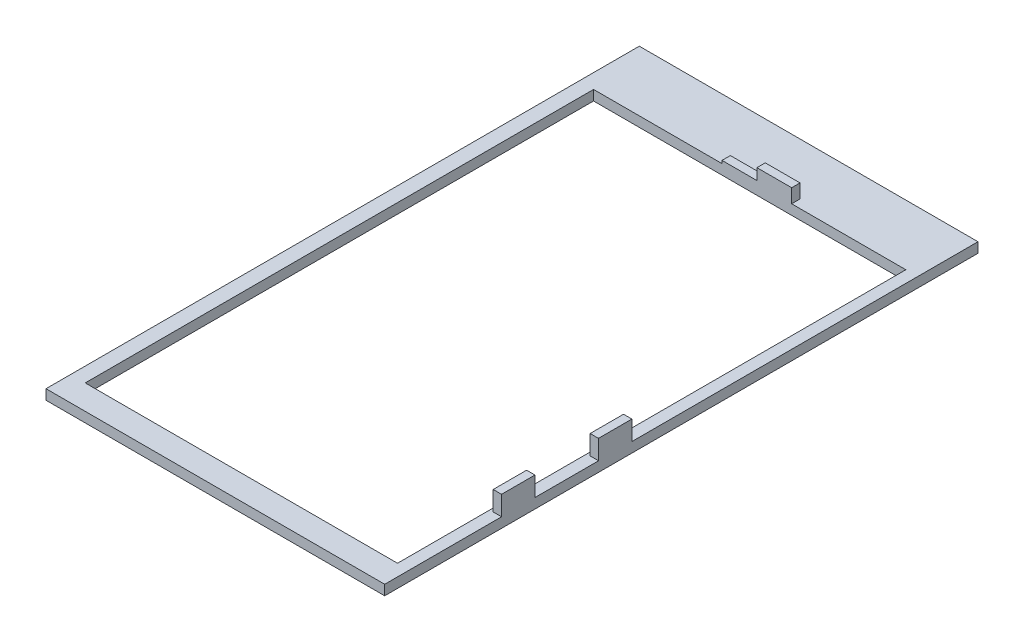
ISO-10303-21;
HEADER;
FILE_DESCRIPTION(('STEP AP214'),'2;1');
FILE_NAME('part.step','',(''),(''),'','','');
FILE_SCHEMA(('AUTOMOTIVE_DESIGN { 1 0 10303 214 1 1 1 1 }'));
ENDSEC;
DATA;
#1=APPLICATION_CONTEXT('core data for automotive mechanical design processes');
#2=APPLICATION_PROTOCOL_DEFINITION('international standard','automotive_design',2000,#1);
#3=PRODUCT_CONTEXT('',#1,'mechanical');
#4=PRODUCT('Part','Part','',(#3));
#5=PRODUCT_RELATED_PRODUCT_CATEGORY('part','',(#4));
#6=PRODUCT_DEFINITION_FORMATION('','',#4);
#7=PRODUCT_DEFINITION_CONTEXT('part definition',#1,'design');
#8=PRODUCT_DEFINITION('design','',#6,#7);
#9=PRODUCT_DEFINITION_SHAPE('','',#8);
#10=(LENGTH_UNIT() NAMED_UNIT(*) SI_UNIT(.MILLI.,.METRE.));
#11=(NAMED_UNIT(*) PLANE_ANGLE_UNIT() SI_UNIT($,.RADIAN.));
#12=(NAMED_UNIT(*) SI_UNIT($,.STERADIAN.) SOLID_ANGLE_UNIT());
#13=UNCERTAINTY_MEASURE_WITH_UNIT(LENGTH_MEASURE(1.E-05),#10,'distance_accuracy_value','');
#14=(GEOMETRIC_REPRESENTATION_CONTEXT(3) GLOBAL_UNCERTAINTY_ASSIGNED_CONTEXT((#13)) GLOBAL_UNIT_ASSIGNED_CONTEXT((#10,
#11,#12)) REPRESENTATION_CONTEXT('',''));
#15=CARTESIAN_POINT('',(0.,0.,0.));
#16=DIRECTION('',(0.,0.,1.));
#17=DIRECTION('',(1.,0.,0.));
#18=AXIS2_PLACEMENT_3D('',#15,#16,#17);
#19=CARTESIAN_POINT('',(0.,1.8,-16.8660709602015));
#20=DIRECTION('',(0.,0.,-1.));
#21=DIRECTION('',(-1.,0.,0.));
#22=AXIS2_PLACEMENT_3D('',#19,#20,#21);
#23=PLANE('',#22);
#24=DIRECTION('',(1.,0.,0.));
#25=VECTOR('',#24,1.);
#26=CARTESIAN_POINT('',(0.,0.,-16.8660709602015));
#27=LINE('',#26,#25);
#28=CARTESIAN_POINT('',(-30.193578772237,0.,-16.8660709602015));
#29=VERTEX_POINT('',#28);
#30=CARTESIAN_POINT('',(30.606421227763,0.,-16.8660709602015));
#31=VERTEX_POINT('',#30);
#32=EDGE_CURVE('E333',#29,#31,#27,.T.);
#33=ORIENTED_EDGE('',*,*,#32,.F.);
#34=DIRECTION('',(0.,-1.,0.));
#35=VECTOR('',#34,1.);
#36=CARTESIAN_POINT('',(-30.193578772237,1.8,-16.8660709602015));
#37=LINE('',#36,#35);
#38=CARTESIAN_POINT('',(-30.193578772237,1.8,-16.8660709602015));
#39=VERTEX_POINT('',#38);
#40=EDGE_CURVE('E11',#39,#29,#37,.T.);
#41=ORIENTED_EDGE('',*,*,#40,.F.);
#42=DIRECTION('',(1.,0.,0.));
#43=VECTOR('',#42,1.);
#44=CARTESIAN_POINT('',(0.,1.8,-16.8660709602015));
#45=LINE('',#44,#43);
#46=CARTESIAN_POINT('',(30.606421227763,1.8,-16.8660709602015));
#47=VERTEX_POINT('',#46);
#48=EDGE_CURVE('E309',#39,#47,#45,.T.);
#49=ORIENTED_EDGE('',*,*,#48,.T.);
#50=DIRECTION('',(0.,-1.,0.));
#51=VECTOR('',#50,1.);
#52=CARTESIAN_POINT('',(30.606421227763,1.8,-16.8660709602015));
#53=LINE('',#52,#51);
#54=EDGE_CURVE('E344',#47,#31,#53,.T.);
#55=ORIENTED_EDGE('',*,*,#54,.T.);
#56=EDGE_LOOP('',(#33,#41,#49,#55));
#57=FACE_BOUND('',#56,.T.);
#58=ADVANCED_FACE('F35',(#57),#23,.T.);
#59=CARTESIAN_POINT('',(-30.193578772237,1.8,0.));
#60=DIRECTION('',(-1.,0.,0.));
#61=DIRECTION('',(0.,0.,1.));
#62=AXIS2_PLACEMENT_3D('',#59,#60,#61);
#63=PLANE('',#62);
#64=DIRECTION('',(0.,0.,-1.));
#65=VECTOR('',#64,1.);
#66=CARTESIAN_POINT('',(-30.193578772237,0.,0.));
#67=LINE('',#66,#65);
#68=CARTESIAN_POINT('',(-30.193578772237,0.,89.6339290397985));
#69=VERTEX_POINT('',#68);
#70=EDGE_CURVE('E336',#69,#29,#67,.T.);
#71=ORIENTED_EDGE('',*,*,#70,.F.);
#72=DIRECTION('',(0.,-1.,0.));
#73=VECTOR('',#72,1.);
#74=CARTESIAN_POINT('',(-30.193578772237,1.8,89.6339290397985));
#75=LINE('',#74,#73);
#76=CARTESIAN_POINT('',(-30.193578772237,1.8,89.6339290397985));
#77=VERTEX_POINT('',#76);
#78=EDGE_CURVE('E44',#77,#69,#75,.T.);
#79=ORIENTED_EDGE('',*,*,#78,.F.);
#80=DIRECTION('',(0.,0.,-1.));
#81=VECTOR('',#80,1.);
#82=CARTESIAN_POINT('',(-30.193578772237,1.8,0.));
#83=LINE('',#82,#81);
#84=EDGE_CURVE('E312',#77,#39,#83,.T.);
#85=ORIENTED_EDGE('',*,*,#84,.T.);
#86=ORIENTED_EDGE('',*,*,#40,.T.);
#87=EDGE_LOOP('',(#71,#79,#85,#86));
#88=FACE_BOUND('',#87,.T.);
#89=ADVANCED_FACE('F383',(#88),#63,.T.);
#90=CARTESIAN_POINT('',(0.,1.8,89.6339290397985));
#91=DIRECTION('',(0.,0.,1.));
#92=DIRECTION('',(1.,0.,0.));
#93=AXIS2_PLACEMENT_3D('',#90,#91,#92);
#94=PLANE('',#93);
#95=DIRECTION('',(-1.,0.,0.));
#96=VECTOR('',#95,1.);
#97=CARTESIAN_POINT('',(0.,0.,89.6339290397985));
#98=LINE('',#97,#96);
#99=CARTESIAN_POINT('',(30.606421227763,0.,89.6339290397985));
#100=VERTEX_POINT('',#99);
#101=EDGE_CURVE('E339',#100,#69,#98,.T.);
#102=ORIENTED_EDGE('',*,*,#101,.F.);
#103=DIRECTION('',(0.,-1.,0.));
#104=VECTOR('',#103,1.);
#105=CARTESIAN_POINT('',(30.606421227763,1.8,89.6339290397985));
#106=LINE('',#105,#104);
#107=CARTESIAN_POINT('',(30.606421227763,1.8,89.6339290397985));
#108=VERTEX_POINT('',#107);
#109=EDGE_CURVE('E346',#108,#100,#106,.T.);
#110=ORIENTED_EDGE('',*,*,#109,.F.);
#111=DIRECTION('',(-1.,0.,0.));
#112=VECTOR('',#111,1.);
#113=CARTESIAN_POINT('',(0.,1.8,89.6339290397985));
#114=LINE('',#113,#112);
#115=EDGE_CURVE('E315',#108,#77,#114,.T.);
#116=ORIENTED_EDGE('',*,*,#115,.T.);
#117=ORIENTED_EDGE('',*,*,#78,.T.);
#118=EDGE_LOOP('',(#102,#110,#116,#117));
#119=FACE_BOUND('',#118,.T.);
#120=ADVANCED_FACE('F389',(#119),#94,.T.);
#121=CARTESIAN_POINT('',(-27.573578772237,1.8,0.));
#122=DIRECTION('',(1.,0.,0.));
#123=DIRECTION('',(0.,0.,-1.));
#124=AXIS2_PLACEMENT_3D('',#121,#122,#123);
#125=PLANE('',#124);
#126=DIRECTION('',(0.,0.,1.));
#127=VECTOR('',#126,1.);
#128=CARTESIAN_POINT('',(-27.573578772237,0.,0.));
#129=LINE('',#128,#127);
#130=CARTESIAN_POINT('',(-27.573578772237,0.,-6.03607096020148));
#131=VERTEX_POINT('',#130);
#132=CARTESIAN_POINT('',(-27.573578772237,0.,85.2139290397985));
#133=VERTEX_POINT('',#132);
#134=EDGE_CURVE('E285',#131,#133,#129,.T.);
#135=ORIENTED_EDGE('',*,*,#134,.F.);
#136=DIRECTION('',(0.,-1.,0.));
#137=VECTOR('',#136,1.);
#138=CARTESIAN_POINT('',(-27.573578772237,1.8,-6.03607096020148));
#139=LINE('',#138,#137);
#140=CARTESIAN_POINT('',(-27.573578772237,1.8,-6.03607096020148));
#141=VERTEX_POINT('',#140);
#142=EDGE_CURVE('E39',#141,#131,#139,.T.);
#143=ORIENTED_EDGE('',*,*,#142,.F.);
#144=DIRECTION('',(0.,0.,1.));
#145=VECTOR('',#144,1.);
#146=CARTESIAN_POINT('',(-27.573578772237,1.8,0.));
#147=LINE('',#146,#145);
#148=CARTESIAN_POINT('',(-27.573578772237,1.8,85.2139290397985));
#149=VERTEX_POINT('',#148);
#150=EDGE_CURVE('E296',#141,#149,#147,.T.);
#151=ORIENTED_EDGE('',*,*,#150,.T.);
#152=DIRECTION('',(0.,-1.,0.));
#153=VECTOR('',#152,1.);
#154=CARTESIAN_POINT('',(-27.573578772237,1.8,85.2139290397985));
#155=LINE('',#154,#153);
#156=EDGE_CURVE('E321',#149,#133,#155,.T.);
#157=ORIENTED_EDGE('',*,*,#156,.T.);
#158=EDGE_LOOP('',(#135,#143,#151,#157));
#159=FACE_BOUND('',#158,.T.);
#160=ADVANCED_FACE('F37',(#159),#125,.T.);
#161=CARTESIAN_POINT('',(0.,1.8,-6.03607096020148));
#162=DIRECTION('',(0.,0.,-1.));
#163=DIRECTION('',(-1.,0.,0.));
#164=AXIS2_PLACEMENT_3D('',#161,#162,#163);
#165=PLANE('',#164);
#166=DIRECTION('',(1.,0.,0.));
#167=VECTOR('',#166,1.);
#168=CARTESIAN_POINT('',(0.,0.,-6.03607096020148));
#169=LINE('',#168,#167);
#170=CARTESIAN_POINT('',(28.486421227763,0.,-6.03607096020148));
#171=VERTEX_POINT('',#170);
#172=EDGE_CURVE('E325',#131,#171,#169,.T.);
#173=ORIENTED_EDGE('',*,*,#172,.T.);
#174=DIRECTION('',(0.,-1.,0.));
#175=VECTOR('',#174,1.);
#176=CARTESIAN_POINT('',(28.486421227763,1.8,-6.03607096020148));
#177=LINE('',#176,#175);
#178=CARTESIAN_POINT('',(28.486421227763,1.8,-6.03607096020148));
#179=VERTEX_POINT('',#178);
#180=EDGE_CURVE('E351',#179,#171,#177,.T.);
#181=ORIENTED_EDGE('',*,*,#180,.F.);
#182=DIRECTION('',(1.,0.,0.));
#183=VECTOR('',#182,1.);
#184=CARTESIAN_POINT('',(0.,1.8,-6.03607096020148));
#185=LINE('',#184,#183);
#186=CARTESIAN_POINT('',(7.98642122776299,1.8,-6.03607096020148));
#187=VERTEX_POINT('',#186);
#188=EDGE_CURVE('E299',#187,#179,#185,.T.);
#189=ORIENTED_EDGE('',*,*,#188,.F.);
#190=DIRECTION('',(0.,1.,0.));
#191=VECTOR('',#190,1.);
#192=CARTESIAN_POINT('',(7.98642122776299,1.8,-6.03607096020148));
#193=LINE('',#192,#191);
#194=CARTESIAN_POINT('',(7.98642122776299,4.3,-6.03607096020148));
#195=VERTEX_POINT('',#194);
#196=EDGE_CURVE('E243',#187,#195,#193,.T.);
#197=ORIENTED_EDGE('',*,*,#196,.T.);
#198=DIRECTION('',(-1.,0.,0.));
#199=VECTOR('',#198,1.);
#200=CARTESIAN_POINT('',(1.74968633608684,4.3,-6.03607096020148));
#201=LINE('',#200,#199);
#202=CARTESIAN_POINT('',(1.74968633608684,4.3,-6.03607096020148));
#203=VERTEX_POINT('',#202);
#204=EDGE_CURVE('E272',#195,#203,#201,.T.);
#205=ORIENTED_EDGE('',*,*,#204,.T.);
#206=DIRECTION('',(0.,-1.,0.));
#207=VECTOR('',#206,1.);
#208=CARTESIAN_POINT('',(1.74968633608684,4.3,-6.03607096020148));
#209=LINE('',#208,#207);
#210=CARTESIAN_POINT('',(1.74968633608684,2.3,-6.03607096020148));
#211=VERTEX_POINT('',#210);
#212=EDGE_CURVE('E275',#203,#211,#209,.T.);
#213=ORIENTED_EDGE('',*,*,#212,.T.);
#214=DIRECTION('',(-1.,0.,0.));
#215=VECTOR('',#214,1.);
#216=CARTESIAN_POINT('',(-4.51357877223701,2.3,-6.03607096020148));
#217=LINE('',#216,#215);
#218=CARTESIAN_POINT('',(-4.51357877223701,2.3,-6.03607096020148));
#219=VERTEX_POINT('',#218);
#220=EDGE_CURVE('E278',#211,#219,#217,.T.);
#221=ORIENTED_EDGE('',*,*,#220,.T.);
#222=DIRECTION('',(0.0245646663522028,-0.999698243054876,0.));
#223=VECTOR('',#222,1.);
#224=CARTESIAN_POINT('',(-4.50129273166284,1.8,-6.03607096020148));
#225=LINE('',#224,#223);
#226=CARTESIAN_POINT('',(-4.50129273166284,1.8,-6.03607096020148));
#227=VERTEX_POINT('',#226);
#228=EDGE_CURVE('E254',#219,#227,#225,.T.);
#229=ORIENTED_EDGE('',*,*,#228,.T.);
#230=EDGE_CURVE('E301',#141,#227,#185,.T.);
#231=ORIENTED_EDGE('',*,*,#230,.F.);
#232=ORIENTED_EDGE('',*,*,#142,.T.);
#233=EDGE_LOOP('',(#173,#181,#189,#197,#205,#213,#221,#229,#231,#232));
#234=FACE_BOUND('',#233,.T.);
#235=ADVANCED_FACE('F360',(#234),#165,.F.);
#236=CARTESIAN_POINT('',(28.486421227763,1.8,0.));
#237=DIRECTION('',(1.,0.,0.));
#238=DIRECTION('',(0.,0.,-1.));
#239=AXIS2_PLACEMENT_3D('',#236,#237,#238);
#240=PLANE('',#239);
#241=DIRECTION('',(0.,0.,1.));
#242=VECTOR('',#241,1.);
#243=CARTESIAN_POINT('',(28.486421227763,0.,0.));
#244=LINE('',#243,#242);
#245=CARTESIAN_POINT('',(28.486421227763,0.,85.2139290397985));
#246=VERTEX_POINT('',#245);
#247=EDGE_CURVE('E327',#171,#246,#244,.T.);
#248=ORIENTED_EDGE('',*,*,#247,.T.);
#249=DIRECTION('',(0.,-1.,0.));
#250=VECTOR('',#249,1.);
#251=CARTESIAN_POINT('',(28.486421227763,1.8,85.2139290397985));
#252=LINE('',#251,#250);
#253=CARTESIAN_POINT('',(28.486421227763,1.8,85.2139290397985));
#254=VERTEX_POINT('',#253);
#255=EDGE_CURVE('E350',#254,#246,#252,.T.);
#256=ORIENTED_EDGE('',*,*,#255,.F.);
#257=DIRECTION('',(0.,0.,1.));
#258=VECTOR('',#257,1.);
#259=CARTESIAN_POINT('',(28.486421227763,1.8,0.));
#260=LINE('',#259,#258);
#261=EDGE_CURVE('E304',#179,#254,#260,.T.);
#262=ORIENTED_EDGE('',*,*,#261,.F.);
#263=ORIENTED_EDGE('',*,*,#180,.T.);
#264=EDGE_LOOP('',(#248,#256,#262,#263));
#265=FACE_BOUND('',#264,.T.);
#266=ADVANCED_FACE('F372',(#265),#240,.F.);
#267=CARTESIAN_POINT('',(0.,1.8,85.2139290397985));
#268=DIRECTION('',(0.,0.,-1.));
#269=DIRECTION('',(-1.,0.,0.));
#270=AXIS2_PLACEMENT_3D('',#267,#268,#269);
#271=PLANE('',#270);
#272=DIRECTION('',(1.,0.,0.));
#273=VECTOR('',#272,1.);
#274=CARTESIAN_POINT('',(0.,0.,85.2139290397985));
#275=LINE('',#274,#273);
#276=EDGE_CURVE('E330',#133,#246,#275,.T.);
#277=ORIENTED_EDGE('',*,*,#276,.F.);
#278=ORIENTED_EDGE('',*,*,#156,.F.);
#279=DIRECTION('',(1.,0.,0.));
#280=VECTOR('',#279,1.);
#281=CARTESIAN_POINT('',(0.,1.8,85.2139290397985));
#282=LINE('',#281,#280);
#283=EDGE_CURVE('E306',#149,#254,#282,.T.);
#284=ORIENTED_EDGE('',*,*,#283,.T.);
#285=ORIENTED_EDGE('',*,*,#255,.T.);
#286=EDGE_LOOP('',(#277,#278,#284,#285));
#287=FACE_BOUND('',#286,.T.);
#288=ADVANCED_FACE('F370',(#287),#271,.T.);
#289=CARTESIAN_POINT('',(30.606421227763,1.8,0.));
#290=DIRECTION('',(-1.,0.,0.));
#291=DIRECTION('',(0.,0.,1.));
#292=AXIS2_PLACEMENT_3D('',#289,#290,#291);
#293=PLANE('',#292);
#294=DIRECTION('',(0.,0.,-1.));
#295=VECTOR('',#294,1.);
#296=CARTESIAN_POINT('',(30.606421227763,0.,0.));
#297=LINE('',#296,#295);
#298=EDGE_CURVE('E300',#100,#31,#297,.T.);
#299=ORIENTED_EDGE('',*,*,#298,.T.);
#300=ORIENTED_EDGE('',*,*,#54,.F.);
#301=DIRECTION('',(0.,0.,-1.));
#302=VECTOR('',#301,1.);
#303=CARTESIAN_POINT('',(30.606421227763,1.8,0.));
#304=LINE('',#303,#302);
#305=CARTESIAN_POINT('',(30.606421227763,1.8,45.2639290397985));
#306=VERTEX_POINT('',#305);
#307=EDGE_CURVE('E318',#306,#47,#304,.T.);
#308=ORIENTED_EDGE('',*,*,#307,.F.);
#309=DIRECTION('',(0.,1.,0.));
#310=VECTOR('',#309,1.);
#311=CARTESIAN_POINT('',(30.606421227763,5.3,45.2639290397985));
#312=LINE('',#311,#310);
#313=CARTESIAN_POINT('',(30.606421227763,5.3,45.2639290397985));
#314=VERTEX_POINT('',#313);
#315=EDGE_CURVE('E211',#306,#314,#312,.T.);
#316=ORIENTED_EDGE('',*,*,#315,.T.);
#317=DIRECTION('',(0.,0.,1.));
#318=VECTOR('',#317,1.);
#319=CARTESIAN_POINT('',(30.606421227763,5.3,51.2639290397985));
#320=LINE('',#319,#318);
#321=CARTESIAN_POINT('',(30.606421227763,5.3,51.2639290397985));
#322=VERTEX_POINT('',#321);
#323=EDGE_CURVE('E190',#314,#322,#320,.T.);
#324=ORIENTED_EDGE('',*,*,#323,.T.);
#325=DIRECTION('',(0.,-0.999983332759982,-0.00577357794089441));
#326=VECTOR('',#325,1.);
#327=CARTESIAN_POINT('',(30.606421227763,1.8,51.2437211801961));
#328=LINE('',#327,#326);
#329=CARTESIAN_POINT('',(30.606421227763,1.8,51.2437211801961));
#330=VERTEX_POINT('',#329);
#331=EDGE_CURVE('E207',#322,#330,#328,.T.);
#332=ORIENTED_EDGE('',*,*,#331,.T.);
#333=CARTESIAN_POINT('',(30.606421227763,1.8,62.6639290397985));
#334=VERTEX_POINT('',#333);
#335=EDGE_CURVE('E322',#334,#330,#304,.T.);
#336=ORIENTED_EDGE('',*,*,#335,.F.);
#337=DIRECTION('',(0.,1.,0.));
#338=VECTOR('',#337,1.);
#339=CARTESIAN_POINT('',(30.606421227763,5.3,62.6639290397985));
#340=LINE('',#339,#338);
#341=CARTESIAN_POINT('',(30.606421227763,5.3,62.6639290397985));
#342=VERTEX_POINT('',#341);
#343=EDGE_CURVE('E217',#334,#342,#340,.T.);
#344=ORIENTED_EDGE('',*,*,#343,.T.);
#345=DIRECTION('',(0.,0.,1.));
#346=VECTOR('',#345,1.);
#347=CARTESIAN_POINT('',(30.606421227763,5.3,68.6639290397985));
#348=LINE('',#347,#346);
#349=CARTESIAN_POINT('',(30.606421227763,5.3,68.6639290397985));
#350=VERTEX_POINT('',#349);
#351=EDGE_CURVE('E235',#342,#350,#348,.T.);
#352=ORIENTED_EDGE('',*,*,#351,.T.);
#353=DIRECTION('',(0.,-0.999998271125345,-0.00185950163268687));
#354=VECTOR('',#353,1.);
#355=CARTESIAN_POINT('',(30.606421227763,1.8,68.6574207728321));
#356=LINE('',#355,#354);
#357=CARTESIAN_POINT('',(30.606421227763,1.8,68.6574207728321));
#358=VERTEX_POINT('',#357);
#359=EDGE_CURVE('E223',#350,#358,#356,.T.);
#360=ORIENTED_EDGE('',*,*,#359,.T.);
#361=EDGE_CURVE('E319',#108,#358,#304,.T.);
#362=ORIENTED_EDGE('',*,*,#361,.F.);
#363=ORIENTED_EDGE('',*,*,#109,.T.);
#364=EDGE_LOOP('',(#299,#300,#308,#316,#324,#332,#336,#344,#352,#360,#362,#363));
#365=FACE_BOUND('',#364,.T.);
#366=ADVANCED_FACE('F379',(#365),#293,.F.);
#367=CARTESIAN_POINT('',(0.,1.8,0.));
#368=DIRECTION('',(0.,1.,0.));
#369=DIRECTION('',(0.,0.,1.));
#370=AXIS2_PLACEMENT_3D('',#367,#368,#369);
#371=PLANE('',#370);
#372=DIRECTION('',(1.,0.,0.));
#373=VECTOR('',#372,1.);
#374=CARTESIAN_POINT('',(29.106421227763,1.8,51.2437211801961));
#375=LINE('',#374,#373);
#376=CARTESIAN_POINT('',(29.106421227763,1.8,51.2437211801961));
#377=VERTEX_POINT('',#376);
#378=EDGE_CURVE('E57',#377,#330,#375,.T.);
#379=ORIENTED_EDGE('',*,*,#378,.F.);
#380=DIRECTION('',(0.,0.,-1.));
#381=VECTOR('',#380,1.);
#382=CARTESIAN_POINT('',(29.106421227763,1.8,45.2639290397985));
#383=LINE('',#382,#381);
#384=CARTESIAN_POINT('',(29.106421227763,1.8,45.2639290397985));
#385=VERTEX_POINT('',#384);
#386=EDGE_CURVE('E52',#377,#385,#383,.T.);
#387=ORIENTED_EDGE('',*,*,#386,.T.);
#388=DIRECTION('',(1.,0.,0.));
#389=VECTOR('',#388,1.);
#390=CARTESIAN_POINT('',(29.106421227763,1.8,45.2639290397985));
#391=LINE('',#390,#389);
#392=EDGE_CURVE('E196',#385,#306,#391,.T.);
#393=ORIENTED_EDGE('',*,*,#392,.T.);
#394=ORIENTED_EDGE('',*,*,#307,.T.);
#395=ORIENTED_EDGE('',*,*,#48,.F.);
#396=ORIENTED_EDGE('',*,*,#84,.F.);
#397=ORIENTED_EDGE('',*,*,#115,.F.);
#398=ORIENTED_EDGE('',*,*,#361,.T.);
#399=DIRECTION('',(1.,0.,0.));
#400=VECTOR('',#399,1.);
#401=CARTESIAN_POINT('',(29.106421227763,1.8,68.6574207728321));
#402=LINE('',#401,#400);
#403=CARTESIAN_POINT('',(29.106421227763,1.8,68.6574207728321));
#404=VERTEX_POINT('',#403);
#405=EDGE_CURVE('E240',#404,#358,#402,.T.);
#406=ORIENTED_EDGE('',*,*,#405,.F.);
#407=DIRECTION('',(0.,0.,-1.));
#408=VECTOR('',#407,1.);
#409=CARTESIAN_POINT('',(29.106421227763,1.8,62.6639290397985));
#410=LINE('',#409,#408);
#411=CARTESIAN_POINT('',(29.106421227763,1.8,62.6639290397985));
#412=VERTEX_POINT('',#411);
#413=EDGE_CURVE('E220',#404,#412,#410,.T.);
#414=ORIENTED_EDGE('',*,*,#413,.T.);
#415=DIRECTION('',(1.,0.,0.));
#416=VECTOR('',#415,1.);
#417=CARTESIAN_POINT('',(29.106421227763,1.8,62.6639290397985));
#418=LINE('',#417,#416);
#419=EDGE_CURVE('E232',#412,#334,#418,.T.);
#420=ORIENTED_EDGE('',*,*,#419,.T.);
#421=ORIENTED_EDGE('',*,*,#335,.T.);
#422=EDGE_LOOP('',(#379,#387,#393,#394,#395,#396,#397,#398,#406,#414,#420,#421));
#423=FACE_BOUND('',#422,.T.);
#424=DIRECTION('',(0.,0.,1.));
#425=VECTOR('',#424,1.);
#426=CARTESIAN_POINT('',(-4.50129273166284,1.8,-7.53607096020148));
#427=LINE('',#426,#425);
#428=CARTESIAN_POINT('',(-4.50129273166284,1.8,-7.53607096020148));
#429=VERTEX_POINT('',#428);
#430=EDGE_CURVE('E283',#429,#227,#427,.T.);
#431=ORIENTED_EDGE('',*,*,#430,.F.);
#432=DIRECTION('',(1.,0.,0.));
#433=VECTOR('',#432,1.);
#434=CARTESIAN_POINT('',(1.74968633608684,1.8,-7.53607096020148));
#435=LINE('',#434,#433);
#436=CARTESIAN_POINT('',(7.98642122776299,1.8,-7.53607096020148));
#437=VERTEX_POINT('',#436);
#438=EDGE_CURVE('E250',#429,#437,#435,.T.);
#439=ORIENTED_EDGE('',*,*,#438,.T.);
#440=DIRECTION('',(0.,0.,1.));
#441=VECTOR('',#440,1.);
#442=CARTESIAN_POINT('',(7.98642122776299,1.8,-7.53607096020148));
#443=LINE('',#442,#441);
#444=EDGE_CURVE('E269',#437,#187,#443,.T.);
#445=ORIENTED_EDGE('',*,*,#444,.T.);
#446=ORIENTED_EDGE('',*,*,#188,.T.);
#447=ORIENTED_EDGE('',*,*,#261,.T.);
#448=ORIENTED_EDGE('',*,*,#283,.F.);
#449=ORIENTED_EDGE('',*,*,#150,.F.);
#450=ORIENTED_EDGE('',*,*,#230,.T.);
#451=EDGE_LOOP('',(#431,#439,#445,#446,#447,#448,#449,#450));
#452=FACE_BOUND('',#451,.T.);
#453=ADVANCED_FACE('F399',(#423,#452),#371,.T.);
#454=CARTESIAN_POINT('',(0.,0.,0.));
#455=DIRECTION('',(0.,1.,0.));
#456=DIRECTION('',(0.,0.,1.));
#457=AXIS2_PLACEMENT_3D('',#454,#455,#456);
#458=PLANE('',#457);
#459=ORIENTED_EDGE('',*,*,#134,.T.);
#460=ORIENTED_EDGE('',*,*,#276,.T.);
#461=ORIENTED_EDGE('',*,*,#247,.F.);
#462=ORIENTED_EDGE('',*,*,#172,.F.);
#463=EDGE_LOOP('',(#459,#460,#461,#462));
#464=FACE_BOUND('',#463,.T.);
#465=ORIENTED_EDGE('',*,*,#32,.T.);
#466=ORIENTED_EDGE('',*,*,#298,.F.);
#467=ORIENTED_EDGE('',*,*,#101,.T.);
#468=ORIENTED_EDGE('',*,*,#70,.T.);
#469=EDGE_LOOP('',(#465,#466,#467,#468));
#470=FACE_BOUND('',#469,.T.);
#471=ADVANCED_FACE('F365',(#464,#470),#458,.F.);
#472=CARTESIAN_POINT('',(-4.50129273166284,1.8,-7.53607096020148));
#473=DIRECTION('',(-0.999698243054875,-0.0245646663522028,0.));
#474=DIRECTION('',(0.0245646663522028,-0.999698243054876,0.));
#475=AXIS2_PLACEMENT_3D('',#472,#473,#474);
#476=PLANE('',#475);
#477=ORIENTED_EDGE('',*,*,#228,.F.);
#478=DIRECTION('',(0.,0.,1.));
#479=VECTOR('',#478,1.);
#480=CARTESIAN_POINT('',(-4.51357877223701,2.3,-7.53607096020148));
#481=LINE('',#480,#479);
#482=CARTESIAN_POINT('',(-4.51357877223701,2.3,-7.53607096020148));
#483=VERTEX_POINT('',#482);
#484=EDGE_CURVE('E286',#483,#219,#481,.T.);
#485=ORIENTED_EDGE('',*,*,#484,.F.);
#486=DIRECTION('',(0.0245646663522028,-0.999698243054876,0.));
#487=VECTOR('',#486,1.);
#488=CARTESIAN_POINT('',(-4.50129273166284,1.8,-7.53607096020148));
#489=LINE('',#488,#487);
#490=EDGE_CURVE('E266',#483,#429,#489,.T.);
#491=ORIENTED_EDGE('',*,*,#490,.T.);
#492=ORIENTED_EDGE('',*,*,#430,.T.);
#493=EDGE_LOOP('',(#477,#485,#491,#492));
#494=FACE_BOUND('',#493,.T.);
#495=ADVANCED_FACE('F403',(#494),#476,.T.);
#496=CARTESIAN_POINT('',(-4.51357877223701,2.3,-7.53607096020148));
#497=DIRECTION('',(0.,1.,0.));
#498=DIRECTION('',(0.,0.,1.));
#499=AXIS2_PLACEMENT_3D('',#496,#497,#498);
#500=PLANE('',#499);
#501=ORIENTED_EDGE('',*,*,#220,.F.);
#502=DIRECTION('',(0.,0.,1.));
#503=VECTOR('',#502,1.);
#504=CARTESIAN_POINT('',(1.74968633608684,2.3,-7.53607096020148));
#505=LINE('',#504,#503);
#506=CARTESIAN_POINT('',(1.74968633608684,2.3,-7.53607096020148));
#507=VERTEX_POINT('',#506);
#508=EDGE_CURVE('E288',#507,#211,#505,.T.);
#509=ORIENTED_EDGE('',*,*,#508,.F.);
#510=DIRECTION('',(-1.,0.,0.));
#511=VECTOR('',#510,1.);
#512=CARTESIAN_POINT('',(-4.51357877223701,2.3,-7.53607096020148));
#513=LINE('',#512,#511);
#514=EDGE_CURVE('E263',#507,#483,#513,.T.);
#515=ORIENTED_EDGE('',*,*,#514,.T.);
#516=ORIENTED_EDGE('',*,*,#484,.T.);
#517=EDGE_LOOP('',(#501,#509,#515,#516));
#518=FACE_BOUND('',#517,.T.);
#519=ADVANCED_FACE('F418',(#518),#500,.T.);
#520=CARTESIAN_POINT('',(1.74968633608684,4.3,-7.53607096020148));
#521=DIRECTION('',(-1.,0.,0.));
#522=DIRECTION('',(0.,-1.,0.));
#523=AXIS2_PLACEMENT_3D('',#520,#521,#522);
#524=PLANE('',#523);
#525=ORIENTED_EDGE('',*,*,#212,.F.);
#526=DIRECTION('',(0.,0.,1.));
#527=VECTOR('',#526,1.);
#528=CARTESIAN_POINT('',(1.74968633608684,4.3,-7.53607096020148));
#529=LINE('',#528,#527);
#530=CARTESIAN_POINT('',(1.74968633608684,4.3,-7.53607096020148));
#531=VERTEX_POINT('',#530);
#532=EDGE_CURVE('E290',#531,#203,#529,.T.);
#533=ORIENTED_EDGE('',*,*,#532,.F.);
#534=DIRECTION('',(0.,-1.,0.));
#535=VECTOR('',#534,1.);
#536=CARTESIAN_POINT('',(1.74968633608684,4.3,-7.53607096020148));
#537=LINE('',#536,#535);
#538=EDGE_CURVE('E260',#531,#507,#537,.T.);
#539=ORIENTED_EDGE('',*,*,#538,.T.);
#540=ORIENTED_EDGE('',*,*,#508,.T.);
#541=EDGE_LOOP('',(#525,#533,#539,#540));
#542=FACE_BOUND('',#541,.T.);
#543=ADVANCED_FACE('F414',(#542),#524,.T.);
#544=CARTESIAN_POINT('',(1.74968633608684,4.3,-7.53607096020148));
#545=DIRECTION('',(0.,1.,0.));
#546=DIRECTION('',(0.,0.,1.));
#547=AXIS2_PLACEMENT_3D('',#544,#545,#546);
#548=PLANE('',#547);
#549=ORIENTED_EDGE('',*,*,#204,.F.);
#550=DIRECTION('',(0.,0.,1.));
#551=VECTOR('',#550,1.);
#552=CARTESIAN_POINT('',(7.98642122776299,4.3,-7.53607096020148));
#553=LINE('',#552,#551);
#554=CARTESIAN_POINT('',(7.98642122776299,4.3,-7.53607096020148));
#555=VERTEX_POINT('',#554);
#556=EDGE_CURVE('E292',#555,#195,#553,.T.);
#557=ORIENTED_EDGE('',*,*,#556,.F.);
#558=DIRECTION('',(-1.,0.,0.));
#559=VECTOR('',#558,1.);
#560=CARTESIAN_POINT('',(1.74968633608684,4.3,-7.53607096020148));
#561=LINE('',#560,#559);
#562=EDGE_CURVE('E257',#555,#531,#561,.T.);
#563=ORIENTED_EDGE('',*,*,#562,.T.);
#564=ORIENTED_EDGE('',*,*,#532,.T.);
#565=EDGE_LOOP('',(#549,#557,#563,#564));
#566=FACE_BOUND('',#565,.T.);
#567=ADVANCED_FACE('F410',(#566),#548,.T.);
#568=CARTESIAN_POINT('',(7.98642122776299,1.8,-7.53607096020148));
#569=DIRECTION('',(1.,0.,0.));
#570=DIRECTION('',(0.,1.,0.));
#571=AXIS2_PLACEMENT_3D('',#568,#569,#570);
#572=PLANE('',#571);
#573=ORIENTED_EDGE('',*,*,#196,.F.);
#574=ORIENTED_EDGE('',*,*,#444,.F.);
#575=DIRECTION('',(0.,1.,0.));
#576=VECTOR('',#575,1.);
#577=CARTESIAN_POINT('',(7.98642122776299,1.8,-7.53607096020148));
#578=LINE('',#577,#576);
#579=EDGE_CURVE('E253',#437,#555,#578,.T.);
#580=ORIENTED_EDGE('',*,*,#579,.T.);
#581=ORIENTED_EDGE('',*,*,#556,.T.);
#582=EDGE_LOOP('',(#573,#574,#580,#581));
#583=FACE_BOUND('',#582,.T.);
#584=ADVANCED_FACE('F406',(#583),#572,.T.);
#585=CARTESIAN_POINT('',(0.,0.,-7.53607096020148));
#586=DIRECTION('',(0.,0.,1.));
#587=DIRECTION('',(1.,0.,0.));
#588=AXIS2_PLACEMENT_3D('',#585,#586,#587);
#589=PLANE('',#588);
#590=ORIENTED_EDGE('',*,*,#438,.F.);
#591=ORIENTED_EDGE('',*,*,#490,.F.);
#592=ORIENTED_EDGE('',*,*,#514,.F.);
#593=ORIENTED_EDGE('',*,*,#538,.F.);
#594=ORIENTED_EDGE('',*,*,#562,.F.);
#595=ORIENTED_EDGE('',*,*,#579,.F.);
#596=EDGE_LOOP('',(#590,#591,#592,#593,#594,#595));
#597=FACE_BOUND('',#596,.T.);
#598=ADVANCED_FACE('F409',(#597),#589,.F.);
#599=CARTESIAN_POINT('',(29.106421227763,1.8,68.6574207728321));
#600=DIRECTION('',(0.,-0.00185950163268687,0.999998271125344));
#601=DIRECTION('',(0.,-0.999998271125345,-0.00185950163268687));
#602=AXIS2_PLACEMENT_3D('',#599,#600,#601);
#603=PLANE('',#602);
#604=ORIENTED_EDGE('',*,*,#359,.F.);
#605=DIRECTION('',(1.,0.,0.));
#606=VECTOR('',#605,1.);
#607=CARTESIAN_POINT('',(29.106421227763,5.3,68.6639290397985));
#608=LINE('',#607,#606);
#609=CARTESIAN_POINT('',(29.106421227763,5.3,68.6639290397985));
#610=VERTEX_POINT('',#609);
#611=EDGE_CURVE('E244',#610,#350,#608,.T.);
#612=ORIENTED_EDGE('',*,*,#611,.F.);
#613=DIRECTION('',(0.,-0.999998271125345,-0.00185950163268687));
#614=VECTOR('',#613,1.);
#615=CARTESIAN_POINT('',(29.106421227763,1.8,68.6574207728321));
#616=LINE('',#615,#614);
#617=EDGE_CURVE('E229',#610,#404,#616,.T.);
#618=ORIENTED_EDGE('',*,*,#617,.T.);
#619=ORIENTED_EDGE('',*,*,#405,.T.);
#620=EDGE_LOOP('',(#604,#612,#618,#619));
#621=FACE_BOUND('',#620,.T.);
#622=ADVANCED_FACE('F428',(#621),#603,.T.);
#623=CARTESIAN_POINT('',(29.106421227763,5.3,68.6639290397985));
#624=DIRECTION('',(0.,1.,0.));
#625=DIRECTION('',(0.,0.,1.));
#626=AXIS2_PLACEMENT_3D('',#623,#624,#625);
#627=PLANE('',#626);
#628=ORIENTED_EDGE('',*,*,#351,.F.);
#629=DIRECTION('',(1.,0.,0.));
#630=VECTOR('',#629,1.);
#631=CARTESIAN_POINT('',(29.106421227763,5.3,62.6639290397985));
#632=LINE('',#631,#630);
#633=CARTESIAN_POINT('',(29.106421227763,5.3,62.6639290397985));
#634=VERTEX_POINT('',#633);
#635=EDGE_CURVE('E246',#634,#342,#632,.T.);
#636=ORIENTED_EDGE('',*,*,#635,.F.);
#637=DIRECTION('',(0.,0.,1.));
#638=VECTOR('',#637,1.);
#639=CARTESIAN_POINT('',(29.106421227763,5.3,68.6639290397985));
#640=LINE('',#639,#638);
#641=EDGE_CURVE('E226',#634,#610,#640,.T.);
#642=ORIENTED_EDGE('',*,*,#641,.T.);
#643=ORIENTED_EDGE('',*,*,#611,.T.);
#644=EDGE_LOOP('',(#628,#636,#642,#643));
#645=FACE_BOUND('',#644,.T.);
#646=ADVANCED_FACE('F434',(#645),#627,.T.);
#647=CARTESIAN_POINT('',(29.106421227763,5.3,62.6639290397985));
#648=DIRECTION('',(0.,0.,-1.));
#649=DIRECTION('',(-1.,0.,0.));
#650=AXIS2_PLACEMENT_3D('',#647,#648,#649);
#651=PLANE('',#650);
#652=ORIENTED_EDGE('',*,*,#343,.F.);
#653=ORIENTED_EDGE('',*,*,#419,.F.);
#654=DIRECTION('',(0.,1.,0.));
#655=VECTOR('',#654,1.);
#656=CARTESIAN_POINT('',(29.106421227763,5.3,62.6639290397985));
#657=LINE('',#656,#655);
#658=EDGE_CURVE('E222',#412,#634,#657,.T.);
#659=ORIENTED_EDGE('',*,*,#658,.T.);
#660=ORIENTED_EDGE('',*,*,#635,.T.);
#661=EDGE_LOOP('',(#652,#653,#659,#660));
#662=FACE_BOUND('',#661,.T.);
#663=ADVANCED_FACE('F430',(#662),#651,.T.);
#664=CARTESIAN_POINT('',(29.106421227763,0.,0.));
#665=DIRECTION('',(1.,0.,0.));
#666=DIRECTION('',(0.,0.,-1.));
#667=AXIS2_PLACEMENT_3D('',#664,#665,#666);
#668=PLANE('',#667);
#669=ORIENTED_EDGE('',*,*,#413,.F.);
#670=ORIENTED_EDGE('',*,*,#617,.F.);
#671=ORIENTED_EDGE('',*,*,#641,.F.);
#672=ORIENTED_EDGE('',*,*,#658,.F.);
#673=EDGE_LOOP('',(#669,#670,#671,#672));
#674=FACE_BOUND('',#673,.T.);
#675=ADVANCED_FACE('F433',(#674),#668,.F.);
#676=CARTESIAN_POINT('',(29.106421227763,1.8,51.2437211801961));
#677=DIRECTION('',(0.,-0.00577357794089441,0.999983332759982));
#678=DIRECTION('',(0.,-0.999983332759982,-0.00577357794089441));
#679=AXIS2_PLACEMENT_3D('',#676,#677,#678);
#680=PLANE('',#679);
#681=ORIENTED_EDGE('',*,*,#331,.F.);
#682=DIRECTION('',(1.,0.,0.));
#683=VECTOR('',#682,1.);
#684=CARTESIAN_POINT('',(29.106421227763,5.3,51.2639290397985));
#685=LINE('',#684,#683);
#686=CARTESIAN_POINT('',(29.106421227763,5.3,51.2639290397985));
#687=VERTEX_POINT('',#686);
#688=EDGE_CURVE('E195',#687,#322,#685,.T.);
#689=ORIENTED_EDGE('',*,*,#688,.F.);
#690=DIRECTION('',(0.,-0.999983332759982,-0.00577357794089441));
#691=VECTOR('',#690,1.);
#692=CARTESIAN_POINT('',(29.106421227763,1.8,51.2437211801961));
#693=LINE('',#692,#691);
#694=EDGE_CURVE('E203',#687,#377,#693,.T.);
#695=ORIENTED_EDGE('',*,*,#694,.T.);
#696=ORIENTED_EDGE('',*,*,#378,.T.);
#697=EDGE_LOOP('',(#681,#689,#695,#696));
#698=FACE_BOUND('',#697,.T.);
#699=ADVANCED_FACE('F444',(#698),#680,.T.);
#700=CARTESIAN_POINT('',(29.106421227763,5.3,51.2639290397985));
#701=DIRECTION('',(0.,1.,0.));
#702=DIRECTION('',(0.,0.,1.));
#703=AXIS2_PLACEMENT_3D('',#700,#701,#702);
#704=PLANE('',#703);
#705=ORIENTED_EDGE('',*,*,#323,.F.);
#706=DIRECTION('',(1.,0.,0.));
#707=VECTOR('',#706,1.);
#708=CARTESIAN_POINT('',(29.106421227763,5.3,45.2639290397985));
#709=LINE('',#708,#707);
#710=CARTESIAN_POINT('',(29.106421227763,5.3,45.2639290397985));
#711=VERTEX_POINT('',#710);
#712=EDGE_CURVE('E184',#711,#314,#709,.T.);
#713=ORIENTED_EDGE('',*,*,#712,.F.);
#714=DIRECTION('',(0.,0.,1.));
#715=VECTOR('',#714,1.);
#716=CARTESIAN_POINT('',(29.106421227763,5.3,51.2639290397985));
#717=LINE('',#716,#715);
#718=EDGE_CURVE('E187',#711,#687,#717,.T.);
#719=ORIENTED_EDGE('',*,*,#718,.T.);
#720=ORIENTED_EDGE('',*,*,#688,.T.);
#721=EDGE_LOOP('',(#705,#713,#719,#720));
#722=FACE_BOUND('',#721,.T.);
#723=ADVANCED_FACE('F186',(#722),#704,.T.);
#724=CARTESIAN_POINT('',(29.106421227763,5.3,45.2639290397985));
#725=DIRECTION('',(0.,0.,-1.));
#726=DIRECTION('',(0.,1.,0.));
#727=AXIS2_PLACEMENT_3D('',#724,#725,#726);
#728=PLANE('',#727);
#729=ORIENTED_EDGE('',*,*,#315,.F.);
#730=ORIENTED_EDGE('',*,*,#392,.F.);
#731=DIRECTION('',(0.,1.,0.));
#732=VECTOR('',#731,1.);
#733=CARTESIAN_POINT('',(29.106421227763,5.3,45.2639290397985));
#734=LINE('',#733,#732);
#735=EDGE_CURVE('E201',#385,#711,#734,.T.);
#736=ORIENTED_EDGE('',*,*,#735,.T.);
#737=ORIENTED_EDGE('',*,*,#712,.T.);
#738=EDGE_LOOP('',(#729,#730,#736,#737));
#739=FACE_BOUND('',#738,.T.);
#740=ADVANCED_FACE('F205',(#739),#728,.T.);
#741=CARTESIAN_POINT('',(29.106421227763,0.,0.));
#742=DIRECTION('',(1.,0.,0.));
#743=DIRECTION('',(0.,0.,-1.));
#744=AXIS2_PLACEMENT_3D('',#741,#742,#743);
#745=PLANE('',#744);
#746=ORIENTED_EDGE('',*,*,#386,.F.);
#747=ORIENTED_EDGE('',*,*,#694,.F.);
#748=ORIENTED_EDGE('',*,*,#718,.F.);
#749=ORIENTED_EDGE('',*,*,#735,.F.);
#750=EDGE_LOOP('',(#746,#747,#748,#749));
#751=FACE_BOUND('',#750,.T.);
#752=ADVANCED_FACE('F200',(#751),#745,.F.);
#753=CLOSED_SHELL('',(#58,#89,#120,#160,#235,#266,#288,#366,#453,#471,#495,#519,#543,#567,#584,
#598,#622,#646,#663,#675,#699,#723,#740,#752));
#754=MANIFOLD_SOLID_BREP('B2',#753);
#755=ADVANCED_BREP_SHAPE_REPRESENTATION('',(#18,#754),#14);
#756=SHAPE_DEFINITION_REPRESENTATION(#9,#755);
ENDSEC;
END-ISO-10303-21;
